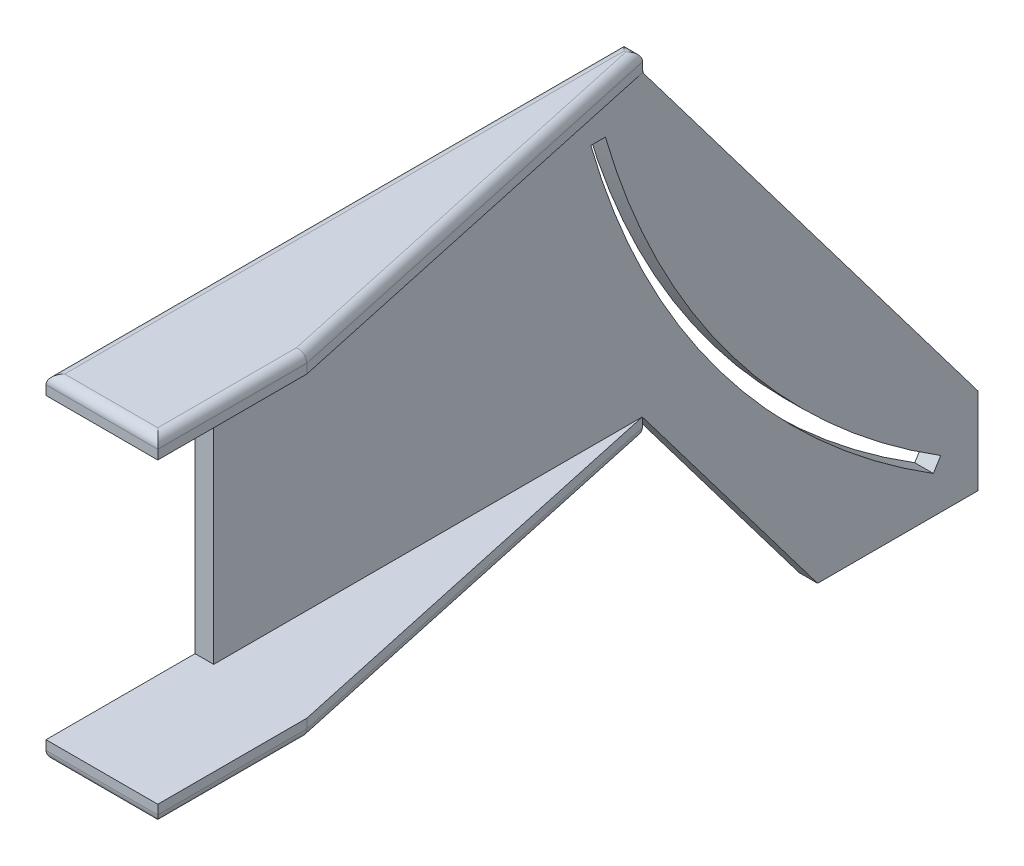
ISO-10303-21;
HEADER;
FILE_DESCRIPTION(('STEP AP214'),'2;1');
FILE_NAME('part.step','',(''),(''),'','','');
FILE_SCHEMA(('AUTOMOTIVE_DESIGN { 1 0 10303 214 1 1 1 1 }'));
ENDSEC;
DATA;
#1=APPLICATION_CONTEXT('core data for automotive mechanical design processes');
#2=APPLICATION_PROTOCOL_DEFINITION('international standard','automotive_design',2000,#1);
#3=PRODUCT_CONTEXT('',#1,'mechanical');
#4=PRODUCT('Part','Part','',(#3));
#5=PRODUCT_RELATED_PRODUCT_CATEGORY('part','',(#4));
#6=PRODUCT_DEFINITION_FORMATION('','',#4);
#7=PRODUCT_DEFINITION_CONTEXT('part definition',#1,'design');
#8=PRODUCT_DEFINITION('design','',#6,#7);
#9=PRODUCT_DEFINITION_SHAPE('','',#8);
#10=(LENGTH_UNIT() NAMED_UNIT(*) SI_UNIT(.MILLI.,.METRE.));
#11=(NAMED_UNIT(*) PLANE_ANGLE_UNIT() SI_UNIT($,.RADIAN.));
#12=(NAMED_UNIT(*) SI_UNIT($,.STERADIAN.) SOLID_ANGLE_UNIT());
#13=UNCERTAINTY_MEASURE_WITH_UNIT(LENGTH_MEASURE(1.E-05),#10,'distance_accuracy_value','');
#14=(GEOMETRIC_REPRESENTATION_CONTEXT(3) GLOBAL_UNCERTAINTY_ASSIGNED_CONTEXT((#13)) GLOBAL_UNIT_ASSIGNED_CONTEXT((#10,
#11,#12)) REPRESENTATION_CONTEXT('',''));
#15=CARTESIAN_POINT('',(0.,0.,0.));
#16=DIRECTION('',(0.,0.,1.));
#17=DIRECTION('',(1.,0.,0.));
#18=AXIS2_PLACEMENT_3D('',#15,#16,#17);
#19=CARTESIAN_POINT('',(3.175,0.,0.));
#20=DIRECTION('',(1.,0.,0.));
#21=DIRECTION('',(0.,0.,-1.));
#22=AXIS2_PLACEMENT_3D('',#19,#20,#21);
#23=PLANE('',#22);
#24=DIRECTION('',(0.,-1.,0.));
#25=VECTOR('',#24,1.);
#26=CARTESIAN_POINT('',(3.175,-30.226,193.675));
#27=LINE('',#26,#25);
#28=CARTESIAN_POINT('',(3.175,-30.226,193.675));
#29=VERTEX_POINT('',#28);
#30=CARTESIAN_POINT('',(3.175,-81.026,193.675));
#31=VERTEX_POINT('',#30);
#32=EDGE_CURVE('E236',#29,#31,#27,.T.);
#33=ORIENTED_EDGE('',*,*,#32,.T.);
#34=DIRECTION('',(0.,0.,-1.));
#35=VECTOR('',#34,1.);
#36=CARTESIAN_POINT('',(3.175,-81.026,193.675));
#37=LINE('',#36,#35);
#38=CARTESIAN_POINT('',(3.175,-81.026,120.620560185282));
#39=VERTEX_POINT('',#38);
#40=EDGE_CURVE('E223',#31,#39,#37,.T.);
#41=ORIENTED_EDGE('',*,*,#40,.T.);
#42=DIRECTION('',(0.,-0.797622102019196,-0.60315751041538));
#43=VECTOR('',#42,1.);
#44=CARTESIAN_POINT('',(3.175,-81.026,120.620560185282));
#45=LINE('',#44,#43);
#46=CARTESIAN_POINT('',(3.175,-120.52375363147,90.7525729679664));
#47=VERTEX_POINT('',#46);
#48=EDGE_CURVE('E232',#39,#47,#45,.T.);
#49=ORIENTED_EDGE('',*,*,#48,.T.);
#50=DIRECTION('',(0.,0.,-1.));
#51=VECTOR('',#50,1.);
#52=CARTESIAN_POINT('',(3.175,-120.52375363147,90.7525729679664));
#53=LINE('',#52,#51);
#54=CARTESIAN_POINT('',(3.175,-120.52375363147,63.4146273051298));
#55=VERTEX_POINT('',#54);
#56=EDGE_CURVE('E242',#47,#55,#53,.T.);
#57=ORIENTED_EDGE('',*,*,#56,.T.);
#58=DIRECTION('',(0.,1.,0.));
#59=VECTOR('',#58,1.);
#60=CARTESIAN_POINT('',(3.175,-105.80178632985,63.4146273051298));
#61=LINE('',#60,#59);
#62=CARTESIAN_POINT('',(3.175,-105.80178632985,63.4146273051298));
#63=VERTEX_POINT('',#62);
#64=EDGE_CURVE('E244',#55,#63,#61,.T.);
#65=ORIENTED_EDGE('',*,*,#64,.T.);
#66=DIRECTION('',(0.,0.797622102019196,0.60315751041538));
#67=VECTOR('',#66,1.);
#68=CARTESIAN_POINT('',(3.175,-30.226,120.56462730513));
#69=LINE('',#68,#67);
#70=CARTESIAN_POINT('',(3.175,-30.6508574659911,120.243352392085));
#71=VERTEX_POINT('',#70);
#72=EDGE_CURVE('E249',#63,#71,#69,.T.);
#73=ORIENTED_EDGE('',*,*,#72,.T.);
#74=CARTESIAN_POINT('',(3.175,-29.6933449182067,118.97712730513));
#75=DIRECTION('',(1.,0.,0.));
#76=DIRECTION('',(0.,0.,-1.));
#77=AXIS2_PLACEMENT_3D('',#74,#75,#76);
#78=CIRCLE('',#77,1.5875);
#79=CARTESIAN_POINT('',(3.175,-29.6933449182067,120.56462730513));
#80=VERTEX_POINT('',#79);
#81=EDGE_CURVE('E307',#71,#80,#78,.F.);
#82=ORIENTED_EDGE('',*,*,#81,.T.);
#83=DIRECTION('',(0.,1.,0.));
#84=VECTOR('',#83,1.);
#85=CARTESIAN_POINT('',(3.175,-27.051,120.56462730513));
#86=LINE('',#85,#84);
#87=CARTESIAN_POINT('',(3.175,-30.226,120.56462730513));
#88=VERTEX_POINT('',#87);
#89=EDGE_CURVE('E310',#88,#80,#86,.T.);
#90=ORIENTED_EDGE('',*,*,#89,.F.);
#91=DIRECTION('',(0.,0.,1.));
#92=VECTOR('',#91,1.);
#93=CARTESIAN_POINT('',(3.175,-30.226,193.675));
#94=LINE('',#93,#92);
#95=EDGE_CURVE('E252',#88,#29,#94,.T.);
#96=ORIENTED_EDGE('',*,*,#95,.T.);
#97=EDGE_LOOP('',(#33,#41,#49,#57,#65,#73,#82,#90,#96));
#98=FACE_BOUND('',#97,.T.);
#99=DIRECTION('',(0.,0.,1.));
#100=VECTOR('',#99,1.);
#101=CARTESIAN_POINT('',(3.175,-36.576,129.390973315616));
#102=LINE('',#101,#100);
#103=CARTESIAN_POINT('',(3.175,-36.576,126.91462730513));
#104=VERTEX_POINT('',#103);
#105=CARTESIAN_POINT('',(3.175,-36.576,129.390973315616));
#106=VERTEX_POINT('',#105);
#107=EDGE_CURVE('E401',#104,#106,#102,.T.);
#108=ORIENTED_EDGE('',*,*,#107,.F.);
#109=CARTESIAN_POINT('',(3.175,0.,0.));
#110=DIRECTION('',(-1.,0.,0.));
#111=DIRECTION('',(0.,0.,-1.));
#112=AXIS2_PLACEMENT_3D('',#109,#110,#111);
#113=CIRCLE('',#112,132.08);
#114=CARTESIAN_POINT('',(3.175,-112.15178632985,69.7646273051298));
#115=VERTEX_POINT('',#114);
#116=EDGE_CURVE('E399',#115,#104,#113,.T.);
#117=ORIENTED_EDGE('',*,*,#116,.F.);
#118=DIRECTION('',(0.,0.849120126664522,-0.528199782746288));
#119=VECTOR('',#118,1.);
#120=CARTESIAN_POINT('',(3.175,-114.17375363147,71.0224030377944));
#121=LINE('',#120,#119);
#122=CARTESIAN_POINT('',(3.175,-114.17375363147,71.0224030377944));
#123=VERTEX_POINT('',#122);
#124=EDGE_CURVE('E407',#123,#115,#121,.T.);
#125=ORIENTED_EDGE('',*,*,#124,.F.);
#126=CARTESIAN_POINT('',(3.175,0.,0.));
#127=DIRECTION('',(1.,0.,0.));
#128=DIRECTION('',(0.,0.,-1.));
#129=AXIS2_PLACEMENT_3D('',#126,#127,#128);
#130=CIRCLE('',#129,134.46125);
#131=EDGE_CURVE('E404',#106,#123,#130,.T.);
#132=ORIENTED_EDGE('',*,*,#131,.F.);
#133=EDGE_LOOP('',(#108,#117,#125,#132));
#134=FACE_BOUND('',#133,.T.);
#135=ADVANCED_FACE('F32',(#98,#134),#23,.T.);
#136=CARTESIAN_POINT('',(0.,0.,0.));
#137=DIRECTION('',(1.,0.,0.));
#138=DIRECTION('',(0.,0.,-1.));
#139=AXIS2_PLACEMENT_3D('',#136,#137,#138);
#140=PLANE('',#139);
#141=DIRECTION('',(0.,1.,0.));
#142=VECTOR('',#141,1.);
#143=CARTESIAN_POINT('',(0.,-84.201,120.620560185282));
#144=LINE('',#143,#142);
#145=CARTESIAN_POINT('',(0.,-82.6135,120.620560185282));
#146=VERTEX_POINT('',#145);
#147=CARTESIAN_POINT('',(0.,-81.026,120.620560185282));
#148=VERTEX_POINT('',#147);
#149=EDGE_CURVE('E208',#146,#148,#144,.T.);
#150=ORIENTED_EDGE('',*,*,#149,.F.);
#151=DIRECTION('',(0.,0.,-1.));
#152=VECTOR('',#151,1.);
#153=CARTESIAN_POINT('',(0.,-82.6135,219.075));
#154=LINE('',#153,#152);
#155=CARTESIAN_POINT('',(0.,-82.6135,219.075));
#156=VERTEX_POINT('',#155);
#157=EDGE_CURVE('E11',#146,#156,#154,.F.);
#158=ORIENTED_EDGE('',*,*,#157,.T.);
#159=DIRECTION('',(0.,1.,0.));
#160=VECTOR('',#159,1.);
#161=CARTESIAN_POINT('',(0.,-84.201,219.075));
#162=LINE('',#161,#160);
#163=CARTESIAN_POINT('',(0.,-81.026,219.075));
#164=VERTEX_POINT('',#163);
#165=EDGE_CURVE('E370',#156,#164,#162,.T.);
#166=ORIENTED_EDGE('',*,*,#165,.T.);
#167=DIRECTION('',(0.,0.,-1.));
#168=VECTOR('',#167,1.);
#169=CARTESIAN_POINT('',(0.,-81.026,219.075));
#170=LINE('',#169,#168);
#171=CARTESIAN_POINT('',(0.,-81.026,193.675));
#172=VERTEX_POINT('',#171);
#173=EDGE_CURVE('E228',#164,#172,#170,.T.);
#174=ORIENTED_EDGE('',*,*,#173,.T.);
#175=DIRECTION('',(0.,-1.,0.));
#176=VECTOR('',#175,1.);
#177=CARTESIAN_POINT('',(0.,-30.226,193.675));
#178=LINE('',#177,#176);
#179=CARTESIAN_POINT('',(0.,-30.226,193.675));
#180=VERTEX_POINT('',#179);
#181=EDGE_CURVE('E255',#180,#172,#178,.T.);
#182=ORIENTED_EDGE('',*,*,#181,.F.);
#183=DIRECTION('',(0.,0.,1.));
#184=VECTOR('',#183,1.);
#185=CARTESIAN_POINT('',(0.,-30.226,120.56462730513));
#186=LINE('',#185,#184);
#187=CARTESIAN_POINT('',(0.,-30.226,219.075));
#188=VERTEX_POINT('',#187);
#189=EDGE_CURVE('E327',#180,#188,#186,.T.);
#190=ORIENTED_EDGE('',*,*,#189,.T.);
#191=DIRECTION('',(0.,-1.,0.));
#192=VECTOR('',#191,1.);
#193=CARTESIAN_POINT('',(0.,-27.051,219.075));
#194=LINE('',#193,#192);
#195=CARTESIAN_POINT('',(0.,-28.6385,219.075));
#196=VERTEX_POINT('',#195);
#197=EDGE_CURVE('E396',#196,#188,#194,.T.);
#198=ORIENTED_EDGE('',*,*,#197,.F.);
#199=DIRECTION('',(0.,0.,1.));
#200=VECTOR('',#199,1.);
#201=CARTESIAN_POINT('',(0.,-28.6385,120.56462730513));
#202=LINE('',#201,#200);
#203=CARTESIAN_POINT('',(0.,-28.6385,120.56462730513));
#204=VERTEX_POINT('',#203);
#205=EDGE_CURVE('E303',#196,#204,#202,.F.);
#206=ORIENTED_EDGE('',*,*,#205,.T.);
#207=DIRECTION('',(0.,-1.,0.));
#208=VECTOR('',#207,1.);
#209=CARTESIAN_POINT('',(0.,-27.051,120.56462730513));
#210=LINE('',#209,#208);
#211=CARTESIAN_POINT('',(0.,-29.6933449182067,120.56462730513));
#212=VERTEX_POINT('',#211);
#213=EDGE_CURVE('E387',#204,#212,#210,.T.);
#214=ORIENTED_EDGE('',*,*,#213,.T.);
#215=CARTESIAN_POINT('',(0.,-29.6933449182067,118.97712730513));
#216=DIRECTION('',(1.,0.,0.));
#217=DIRECTION('',(0.,0.,-1.));
#218=AXIS2_PLACEMENT_3D('',#215,#216,#217);
#219=CIRCLE('',#218,1.5875);
#220=CARTESIAN_POINT('',(0.,-30.6508574659911,120.243352392085));
#221=VERTEX_POINT('',#220);
#222=EDGE_CURVE('E305',#212,#221,#219,.T.);
#223=ORIENTED_EDGE('',*,*,#222,.T.);
#224=DIRECTION('',(0.,0.797622102019196,0.60315751041538));
#225=VECTOR('',#224,1.);
#226=CARTESIAN_POINT('',(0.,-30.226,120.56462730513));
#227=LINE('',#226,#225);
#228=CARTESIAN_POINT('',(0.,-105.80178632985,63.4146273051298));
#229=VERTEX_POINT('',#228);
#230=EDGE_CURVE('E265',#229,#221,#227,.T.);
#231=ORIENTED_EDGE('',*,*,#230,.F.);
#232=DIRECTION('',(0.,1.,0.));
#233=VECTOR('',#232,1.);
#234=CARTESIAN_POINT('',(0.,-105.80178632985,63.4146273051298));
#235=LINE('',#234,#233);
#236=CARTESIAN_POINT('',(0.,-120.52375363147,63.4146273051298));
#237=VERTEX_POINT('',#236);
#238=EDGE_CURVE('E263',#237,#229,#235,.T.);
#239=ORIENTED_EDGE('',*,*,#238,.F.);
#240=DIRECTION('',(0.,0.,-1.));
#241=VECTOR('',#240,1.);
#242=CARTESIAN_POINT('',(0.,-120.52375363147,90.7525729679664));
#243=LINE('',#242,#241);
#244=CARTESIAN_POINT('',(0.,-120.52375363147,90.7525729679664));
#245=VERTEX_POINT('',#244);
#246=EDGE_CURVE('E261',#245,#237,#243,.T.);
#247=ORIENTED_EDGE('',*,*,#246,.F.);
#248=DIRECTION('',(0.,-0.797622102019196,-0.60315751041538));
#249=VECTOR('',#248,1.);
#250=CARTESIAN_POINT('',(0.,-81.026,120.620560185282));
#251=LINE('',#250,#249);
#252=EDGE_CURVE('E258',#148,#245,#251,.T.);
#253=ORIENTED_EDGE('',*,*,#252,.F.);
#254=EDGE_LOOP('',(#150,#158,#166,#174,#182,#190,#198,#206,#214,#223,#231,#239,#247,#253));
#255=FACE_BOUND('',#254,.T.);
#256=CARTESIAN_POINT('',(0.,0.,0.));
#257=DIRECTION('',(-1.,0.,0.));
#258=DIRECTION('',(0.,0.,-1.));
#259=AXIS2_PLACEMENT_3D('',#256,#257,#258);
#260=CIRCLE('',#259,132.08);
#261=CARTESIAN_POINT('',(0.,-112.15178632985,69.7646273051298));
#262=VERTEX_POINT('',#261);
#263=CARTESIAN_POINT('',(0.,-36.576,126.91462730513));
#264=VERTEX_POINT('',#263);
#265=EDGE_CURVE('E398',#262,#264,#260,.T.);
#266=ORIENTED_EDGE('',*,*,#265,.T.);
#267=DIRECTION('',(0.,0.,1.));
#268=VECTOR('',#267,1.);
#269=CARTESIAN_POINT('',(0.,-36.576,129.390973315616));
#270=LINE('',#269,#268);
#271=CARTESIAN_POINT('',(0.,-36.576,129.390973315616));
#272=VERTEX_POINT('',#271);
#273=EDGE_CURVE('E412',#264,#272,#270,.T.);
#274=ORIENTED_EDGE('',*,*,#273,.T.);
#275=CARTESIAN_POINT('',(0.,0.,0.));
#276=DIRECTION('',(1.,0.,0.));
#277=DIRECTION('',(0.,0.,-1.));
#278=AXIS2_PLACEMENT_3D('',#275,#276,#277);
#279=CIRCLE('',#278,134.46125);
#280=CARTESIAN_POINT('',(0.,-114.17375363147,71.0224030377944));
#281=VERTEX_POINT('',#280);
#282=EDGE_CURVE('E415',#272,#281,#279,.T.);
#283=ORIENTED_EDGE('',*,*,#282,.T.);
#284=DIRECTION('',(0.,0.849120126664522,-0.528199782746288));
#285=VECTOR('',#284,1.);
#286=CARTESIAN_POINT('',(0.,-114.17375363147,71.0224030377944));
#287=LINE('',#286,#285);
#288=EDGE_CURVE('E402',#281,#262,#287,.T.);
#289=ORIENTED_EDGE('',*,*,#288,.T.);
#290=EDGE_LOOP('',(#266,#274,#283,#289));
#291=FACE_BOUND('',#290,.T.);
#292=ADVANCED_FACE('F435',(#255,#291),#140,.F.);
#293=CARTESIAN_POINT('',(3.175,-30.226,193.675));
#294=DIRECTION('',(0.,0.,-1.));
#295=DIRECTION('',(-1.,0.,0.));
#296=AXIS2_PLACEMENT_3D('',#293,#294,#295);
#297=PLANE('',#296);
#298=ORIENTED_EDGE('',*,*,#181,.T.);
#299=DIRECTION('',(-1.,0.,0.));
#300=VECTOR('',#299,1.);
#301=CARTESIAN_POINT('',(3.175,-81.026,193.675));
#302=LINE('',#301,#300);
#303=EDGE_CURVE('E217',#31,#172,#302,.T.);
#304=ORIENTED_EDGE('',*,*,#303,.F.);
#305=ORIENTED_EDGE('',*,*,#32,.F.);
#306=DIRECTION('',(-1.,0.,0.));
#307=VECTOR('',#306,1.);
#308=CARTESIAN_POINT('',(3.175,-30.226,193.675));
#309=LINE('',#308,#307);
#310=EDGE_CURVE('E254',#29,#180,#309,.T.);
#311=ORIENTED_EDGE('',*,*,#310,.T.);
#312=EDGE_LOOP('',(#298,#304,#305,#311));
#313=FACE_BOUND('',#312,.T.);
#314=ADVANCED_FACE('F460',(#313),#297,.F.);
#315=CARTESIAN_POINT('',(3.175,-81.026,120.620560185282));
#316=DIRECTION('',(0.,0.60315751041538,-0.797622102019196));
#317=DIRECTION('',(0.,0.797622102019196,0.60315751041538));
#318=AXIS2_PLACEMENT_3D('',#315,#316,#317);
#319=PLANE('',#318);
#320=ORIENTED_EDGE('',*,*,#252,.T.);
#321=DIRECTION('',(-1.,0.,0.));
#322=VECTOR('',#321,1.);
#323=CARTESIAN_POINT('',(3.175,-120.52375363147,90.7525729679664));
#324=LINE('',#323,#322);
#325=EDGE_CURVE('E218',#47,#245,#324,.T.);
#326=ORIENTED_EDGE('',*,*,#325,.F.);
#327=ORIENTED_EDGE('',*,*,#48,.F.);
#328=DIRECTION('',(-1.,0.,0.));
#329=VECTOR('',#328,1.);
#330=CARTESIAN_POINT('',(3.175,-81.026,120.620560185282));
#331=LINE('',#330,#329);
#332=EDGE_CURVE('E212',#39,#148,#331,.T.);
#333=ORIENTED_EDGE('',*,*,#332,.T.);
#334=EDGE_LOOP('',(#320,#326,#327,#333));
#335=FACE_BOUND('',#334,.T.);
#336=ADVANCED_FACE('F239',(#335),#319,.F.);
#337=CARTESIAN_POINT('',(3.175,-120.52375363147,90.7525729679664));
#338=DIRECTION('',(0.,1.,0.));
#339=DIRECTION('',(0.,0.,1.));
#340=AXIS2_PLACEMENT_3D('',#337,#338,#339);
#341=PLANE('',#340);
#342=ORIENTED_EDGE('',*,*,#246,.T.);
#343=DIRECTION('',(-1.,0.,0.));
#344=VECTOR('',#343,1.);
#345=CARTESIAN_POINT('',(3.175,-120.52375363147,63.4146273051298));
#346=LINE('',#345,#344);
#347=EDGE_CURVE('E273',#55,#237,#346,.T.);
#348=ORIENTED_EDGE('',*,*,#347,.F.);
#349=ORIENTED_EDGE('',*,*,#56,.F.);
#350=ORIENTED_EDGE('',*,*,#325,.T.);
#351=EDGE_LOOP('',(#342,#348,#349,#350));
#352=FACE_BOUND('',#351,.T.);
#353=ADVANCED_FACE('F471',(#352),#341,.F.);
#354=CARTESIAN_POINT('',(3.175,-105.80178632985,63.4146273051298));
#355=DIRECTION('',(0.,0.,1.));
#356=DIRECTION('',(1.,0.,0.));
#357=AXIS2_PLACEMENT_3D('',#354,#355,#356);
#358=PLANE('',#357);
#359=ORIENTED_EDGE('',*,*,#238,.T.);
#360=DIRECTION('',(-1.,0.,0.));
#361=VECTOR('',#360,1.);
#362=CARTESIAN_POINT('',(3.175,-105.80178632985,63.4146273051298));
#363=LINE('',#362,#361);
#364=EDGE_CURVE('E270',#63,#229,#363,.T.);
#365=ORIENTED_EDGE('',*,*,#364,.F.);
#366=ORIENTED_EDGE('',*,*,#64,.F.);
#367=ORIENTED_EDGE('',*,*,#347,.T.);
#368=EDGE_LOOP('',(#359,#365,#366,#367));
#369=FACE_BOUND('',#368,.T.);
#370=ADVANCED_FACE('F467',(#369),#358,.F.);
#371=CARTESIAN_POINT('',(3.175,-30.226,120.56462730513));
#372=DIRECTION('',(0.,-0.60315751041538,0.797622102019196));
#373=DIRECTION('',(0.,-0.797622102019196,-0.60315751041538));
#374=AXIS2_PLACEMENT_3D('',#371,#372,#373);
#375=PLANE('',#374);
#376=ORIENTED_EDGE('',*,*,#230,.T.);
#377=DIRECTION('',(-1.,0.,0.));
#378=VECTOR('',#377,1.);
#379=CARTESIAN_POINT('',(3.175,-30.6508574659911,120.243352392085));
#380=LINE('',#379,#378);
#381=EDGE_CURVE('E283',#221,#71,#380,.F.);
#382=ORIENTED_EDGE('',*,*,#381,.T.);
#383=ORIENTED_EDGE('',*,*,#72,.F.);
#384=ORIENTED_EDGE('',*,*,#364,.T.);
#385=EDGE_LOOP('',(#376,#382,#383,#384));
#386=FACE_BOUND('',#385,.T.);
#387=ADVANCED_FACE('F464',(#386),#375,.F.);
#388=CARTESIAN_POINT('',(3.175,0.,0.));
#389=DIRECTION('',(-1.,0.,0.));
#390=DIRECTION('',(0.,0.,1.));
#391=AXIS2_PLACEMENT_3D('',#388,#389,#390);
#392=CYLINDRICAL_SURFACE('',#391,132.08);
#393=ORIENTED_EDGE('',*,*,#265,.F.);
#394=DIRECTION('',(-1.,0.,0.));
#395=VECTOR('',#394,1.);
#396=CARTESIAN_POINT('',(3.175,-112.15178632985,69.7646273051298));
#397=LINE('',#396,#395);
#398=EDGE_CURVE('E409',#115,#262,#397,.T.);
#399=ORIENTED_EDGE('',*,*,#398,.F.);
#400=ORIENTED_EDGE('',*,*,#116,.T.);
#401=DIRECTION('',(-1.,0.,0.));
#402=VECTOR('',#401,1.);
#403=CARTESIAN_POINT('',(3.175,-36.576,126.91462730513));
#404=LINE('',#403,#402);
#405=EDGE_CURVE('E259',#104,#264,#404,.T.);
#406=ORIENTED_EDGE('',*,*,#405,.T.);
#407=EDGE_LOOP('',(#393,#399,#400,#406));
#408=FACE_BOUND('',#407,.T.);
#409=ADVANCED_FACE('F429',(#408),#392,.T.);
#410=CARTESIAN_POINT('',(3.175,-36.576,129.390973315616));
#411=DIRECTION('',(0.,-1.,0.));
#412=DIRECTION('',(0.,0.,-1.));
#413=AXIS2_PLACEMENT_3D('',#410,#411,#412);
#414=PLANE('',#413);
#415=ORIENTED_EDGE('',*,*,#273,.F.);
#416=ORIENTED_EDGE('',*,*,#405,.F.);
#417=ORIENTED_EDGE('',*,*,#107,.T.);
#418=DIRECTION('',(-1.,0.,0.));
#419=VECTOR('',#418,1.);
#420=CARTESIAN_POINT('',(3.175,-36.576,129.390973315616));
#421=LINE('',#420,#419);
#422=EDGE_CURVE('E424',#106,#272,#421,.T.);
#423=ORIENTED_EDGE('',*,*,#422,.T.);
#424=EDGE_LOOP('',(#415,#416,#417,#423));
#425=FACE_BOUND('',#424,.T.);
#426=ADVANCED_FACE('F443',(#425),#414,.T.);
#427=CARTESIAN_POINT('',(3.175,0.,0.));
#428=DIRECTION('',(-1.,0.,0.));
#429=DIRECTION('',(0.,0.,1.));
#430=AXIS2_PLACEMENT_3D('',#427,#428,#429);
#431=CYLINDRICAL_SURFACE('',#430,134.46125);
#432=ORIENTED_EDGE('',*,*,#282,.F.);
#433=ORIENTED_EDGE('',*,*,#422,.F.);
#434=ORIENTED_EDGE('',*,*,#131,.T.);
#435=DIRECTION('',(-1.,0.,0.));
#436=VECTOR('',#435,1.);
#437=CARTESIAN_POINT('',(3.175,-114.17375363147,71.0224030377944));
#438=LINE('',#437,#436);
#439=EDGE_CURVE('E422',#123,#281,#438,.T.);
#440=ORIENTED_EDGE('',*,*,#439,.T.);
#441=EDGE_LOOP('',(#432,#433,#434,#440));
#442=FACE_BOUND('',#441,.T.);
#443=ADVANCED_FACE('F445',(#442),#431,.F.);
#444=CARTESIAN_POINT('',(3.175,-114.17375363147,71.0224030377944));
#445=DIRECTION('',(0.,0.528199782746288,0.849120126664522));
#446=DIRECTION('',(0.,-0.849120126664523,0.528199782746288));
#447=AXIS2_PLACEMENT_3D('',#444,#445,#446);
#448=PLANE('',#447);
#449=ORIENTED_EDGE('',*,*,#288,.F.);
#450=ORIENTED_EDGE('',*,*,#439,.F.);
#451=ORIENTED_EDGE('',*,*,#124,.T.);
#452=ORIENTED_EDGE('',*,*,#398,.T.);
#453=EDGE_LOOP('',(#449,#450,#451,#452));
#454=FACE_BOUND('',#453,.T.);
#455=ADVANCED_FACE('F439',(#454),#448,.T.);
#456=CARTESIAN_POINT('',(0.,-27.051,219.075));
#457=DIRECTION('',(0.,0.,-1.));
#458=DIRECTION('',(-1.,0.,0.));
#459=AXIS2_PLACEMENT_3D('',#456,#457,#458);
#460=PLANE('',#459);
#461=DIRECTION('',(0.,-1.,0.));
#462=VECTOR('',#461,1.);
#463=CARTESIAN_POINT('',(19.05,-27.051,219.075));
#464=LINE('',#463,#462);
#465=CARTESIAN_POINT('',(19.05,-28.6385,219.075));
#466=VERTEX_POINT('',#465);
#467=CARTESIAN_POINT('',(19.05,-30.226,219.075));
#468=VERTEX_POINT('',#467);
#469=EDGE_CURVE('E394',#466,#468,#464,.T.);
#470=ORIENTED_EDGE('',*,*,#469,.F.);
#471=DIRECTION('',(1.,0.,0.));
#472=VECTOR('',#471,1.);
#473=CARTESIAN_POINT('',(0.,-28.6385,219.075));
#474=LINE('',#473,#472);
#475=EDGE_CURVE('E296',#466,#196,#474,.F.);
#476=ORIENTED_EDGE('',*,*,#475,.T.);
#477=ORIENTED_EDGE('',*,*,#197,.T.);
#478=DIRECTION('',(1.,0.,0.));
#479=VECTOR('',#478,1.);
#480=CARTESIAN_POINT('',(0.,-30.226,219.075));
#481=LINE('',#480,#479);
#482=EDGE_CURVE('E378',#188,#468,#481,.T.);
#483=ORIENTED_EDGE('',*,*,#482,.T.);
#484=EDGE_LOOP('',(#470,#476,#477,#483));
#485=FACE_BOUND('',#484,.T.);
#486=ADVANCED_FACE('F452',(#485),#460,.F.);
#487=CARTESIAN_POINT('',(19.05,-27.051,193.675));
#488=DIRECTION('',(-1.,0.,0.));
#489=DIRECTION('',(0.,0.,1.));
#490=AXIS2_PLACEMENT_3D('',#487,#488,#489);
#491=PLANE('',#490);
#492=DIRECTION('',(0.,-1.,0.));
#493=VECTOR('',#492,1.);
#494=CARTESIAN_POINT('',(19.05,-27.051,193.675));
#495=LINE('',#494,#493);
#496=CARTESIAN_POINT('',(19.05,-28.6385,193.675));
#497=VERTEX_POINT('',#496);
#498=CARTESIAN_POINT('',(19.05,-30.226,193.675));
#499=VERTEX_POINT('',#498);
#500=EDGE_CURVE('E392',#497,#499,#495,.T.);
#501=ORIENTED_EDGE('',*,*,#500,.F.);
#502=DIRECTION('',(0.,0.,-1.));
#503=VECTOR('',#502,1.);
#504=CARTESIAN_POINT('',(19.05,-28.6385,219.075));
#505=LINE('',#504,#503);
#506=EDGE_CURVE('E299',#497,#466,#505,.F.);
#507=ORIENTED_EDGE('',*,*,#506,.T.);
#508=ORIENTED_EDGE('',*,*,#469,.T.);
#509=DIRECTION('',(0.,0.,-1.));
#510=VECTOR('',#509,1.);
#511=CARTESIAN_POINT('',(19.05,-30.226,193.675));
#512=LINE('',#511,#510);
#513=EDGE_CURVE('E381',#468,#499,#512,.T.);
#514=ORIENTED_EDGE('',*,*,#513,.T.);
#515=EDGE_LOOP('',(#501,#507,#508,#514));
#516=FACE_BOUND('',#515,.T.);
#517=ADVANCED_FACE('F575',(#516),#491,.F.);
#518=CARTESIAN_POINT('',(3.175,-27.051,120.56462730513));
#519=DIRECTION('',(-0.977227830330708,0.,0.212192760543656));
#520=DIRECTION('',(0.212192760543656,0.,0.977227830330708));
#521=AXIS2_PLACEMENT_3D('',#518,#519,#520);
#522=PLANE('',#521);
#523=DIRECTION('',(0.,-1.,0.));
#524=VECTOR('',#523,1.);
#525=CARTESIAN_POINT('',(3.175,-27.051,120.56462730513));
#526=LINE('',#525,#524);
#527=CARTESIAN_POINT('',(3.175,-28.6385,120.56462730513));
#528=VERTEX_POINT('',#527);
#529=EDGE_CURVE('E390',#528,#80,#526,.T.);
#530=ORIENTED_EDGE('',*,*,#529,.F.);
#531=DIRECTION('',(-0.212192760543656,0.,-0.977227830330708));
#532=VECTOR('',#531,1.);
#533=CARTESIAN_POINT('',(19.05,-28.6385,193.675));
#534=LINE('',#533,#532);
#535=EDGE_CURVE('E301',#528,#497,#534,.F.);
#536=ORIENTED_EDGE('',*,*,#535,.T.);
#537=ORIENTED_EDGE('',*,*,#500,.T.);
#538=DIRECTION('',(-0.212192760543656,0.,-0.977227830330708));
#539=VECTOR('',#538,1.);
#540=CARTESIAN_POINT('',(3.175,-30.226,120.56462730513));
#541=LINE('',#540,#539);
#542=EDGE_CURVE('E384',#499,#88,#541,.T.);
#543=ORIENTED_EDGE('',*,*,#542,.T.);
#544=ORIENTED_EDGE('',*,*,#89,.T.);
#545=EDGE_LOOP('',(#530,#536,#537,#543,#544));
#546=FACE_BOUND('',#545,.T.);
#547=ADVANCED_FACE('F573',(#546),#522,.F.);
#548=CARTESIAN_POINT('',(0.,-27.051,120.56462730513));
#549=DIRECTION('',(0.,0.,1.));
#550=DIRECTION('',(1.,0.,0.));
#551=AXIS2_PLACEMENT_3D('',#548,#549,#550);
#552=PLANE('',#551);
#553=ORIENTED_EDGE('',*,*,#529,.T.);
#554=DIRECTION('',(-1.,0.,0.));
#555=VECTOR('',#554,1.);
#556=CARTESIAN_POINT('',(0.,-29.6933449182067,120.56462730513));
#557=LINE('',#556,#555);
#558=EDGE_CURVE('E280',#80,#212,#557,.T.);
#559=ORIENTED_EDGE('',*,*,#558,.T.);
#560=ORIENTED_EDGE('',*,*,#213,.F.);
#561=DIRECTION('',(-1.,0.,0.));
#562=VECTOR('',#561,1.);
#563=CARTESIAN_POINT('',(3.175,-28.6385,120.56462730513));
#564=LINE('',#563,#562);
#565=EDGE_CURVE('E278',#204,#528,#564,.F.);
#566=ORIENTED_EDGE('',*,*,#565,.T.);
#567=EDGE_LOOP('',(#553,#559,#560,#566));
#568=FACE_BOUND('',#567,.T.);
#569=ADVANCED_FACE('F566',(#568),#552,.F.);
#570=CARTESIAN_POINT('',(0.,-27.051,0.));
#571=DIRECTION('',(0.,1.,0.));
#572=DIRECTION('',(0.,0.,1.));
#573=AXIS2_PLACEMENT_3D('',#570,#571,#572);
#574=PLANE('',#573);
#575=DIRECTION('',(0.,0.,1.));
#576=VECTOR('',#575,1.);
#577=CARTESIAN_POINT('',(1.5875,-27.051,219.075));
#578=LINE('',#577,#576);
#579=CARTESIAN_POINT('',(1.5875,-27.051,122.15212730513));
#580=VERTEX_POINT('',#579);
#581=CARTESIAN_POINT('',(1.5875,-27.051,217.4875));
#582=VERTEX_POINT('',#581);
#583=EDGE_CURVE('E285',#580,#582,#578,.T.);
#584=ORIENTED_EDGE('',*,*,#583,.T.);
#585=DIRECTION('',(1.,0.,0.));
#586=VECTOR('',#585,1.);
#587=CARTESIAN_POINT('',(19.05,-27.051,217.4875));
#588=LINE('',#587,#586);
#589=CARTESIAN_POINT('',(17.4625,-27.051,217.4875));
#590=VERTEX_POINT('',#589);
#591=EDGE_CURVE('E293',#582,#590,#588,.T.);
#592=ORIENTED_EDGE('',*,*,#591,.T.);
#593=DIRECTION('',(0.,0.,-1.));
#594=VECTOR('',#593,1.);
#595=CARTESIAN_POINT('',(17.4625,-27.051,193.675));
#596=LINE('',#595,#594);
#597=CARTESIAN_POINT('',(17.4625,-27.051,193.845367826204));
#598=VERTEX_POINT('',#597);
#599=EDGE_CURVE('E291',#590,#598,#596,.T.);
#600=ORIENTED_EDGE('',*,*,#599,.T.);
#601=DIRECTION('',(-0.212192760543656,0.,-0.977227830330708));
#602=VECTOR('',#601,1.);
#603=CARTESIAN_POINT('',(1.62365081935001,-27.051,120.901483312493));
#604=LINE('',#603,#602);
#605=CARTESIAN_POINT('',(1.89521246855637,-27.051,122.15212730513));
#606=VERTEX_POINT('',#605);
#607=EDGE_CURVE('E289',#598,#606,#604,.T.);
#608=ORIENTED_EDGE('',*,*,#607,.T.);
#609=DIRECTION('',(-1.,0.,0.));
#610=VECTOR('',#609,1.);
#611=CARTESIAN_POINT('',(0.,-27.051,122.15212730513));
#612=LINE('',#611,#610);
#613=EDGE_CURVE('E287',#606,#580,#612,.T.);
#614=ORIENTED_EDGE('',*,*,#613,.T.);
#615=EDGE_LOOP('',(#584,#592,#600,#608,#614));
#616=FACE_BOUND('',#615,.T.);
#617=ADVANCED_FACE('F559',(#616),#574,.T.);
#618=CARTESIAN_POINT('',(0.,-30.226,0.));
#619=DIRECTION('',(0.,1.,0.));
#620=DIRECTION('',(0.,0.,1.));
#621=AXIS2_PLACEMENT_3D('',#618,#619,#620);
#622=PLANE('',#621);
#623=ORIENTED_EDGE('',*,*,#310,.F.);
#624=ORIENTED_EDGE('',*,*,#95,.F.);
#625=ORIENTED_EDGE('',*,*,#542,.F.);
#626=ORIENTED_EDGE('',*,*,#513,.F.);
#627=ORIENTED_EDGE('',*,*,#482,.F.);
#628=ORIENTED_EDGE('',*,*,#189,.F.);
#629=EDGE_LOOP('',(#623,#624,#625,#626,#627,#628));
#630=FACE_BOUND('',#629,.T.);
#631=ADVANCED_FACE('F485',(#630),#622,.F.);
#632=CARTESIAN_POINT('',(0.,-29.6933449182067,118.97712730513));
#633=DIRECTION('',(1.,0.,0.));
#634=DIRECTION('',(0.,0.,-1.));
#635=AXIS2_PLACEMENT_3D('',#632,#633,#634);
#636=CYLINDRICAL_SURFACE('',#635,1.5875);
#637=ORIENTED_EDGE('',*,*,#81,.F.);
#638=ORIENTED_EDGE('',*,*,#381,.F.);
#639=ORIENTED_EDGE('',*,*,#222,.F.);
#640=ORIENTED_EDGE('',*,*,#558,.F.);
#641=EDGE_LOOP('',(#637,#638,#639,#640));
#642=FACE_BOUND('',#641,.T.);
#643=ADVANCED_FACE('F481',(#642),#636,.F.);
#644=CARTESIAN_POINT('',(0.,-28.6385,122.15212730513));
#645=DIRECTION('',(1.,0.,0.));
#646=DIRECTION('',(0.,0.,-1.));
#647=AXIS2_PLACEMENT_3D('',#644,#645,#646);
#648=CYLINDRICAL_SURFACE('',#647,1.5875);
#649=CARTESIAN_POINT('',(1.5875,-28.6385,122.15212730513));
#650=DIRECTION('',(0.707106781186547,0.,-0.707106781186547));
#651=DIRECTION('',(-0.707106781186547,0.,-0.707106781186547));
#652=AXIS2_PLACEMENT_3D('',#649,#650,#651);
#653=ELLIPSE('',#652,2.24506403026729,1.5875);
#654=EDGE_CURVE('E321',#580,#204,#653,.F.);
#655=ORIENTED_EDGE('',*,*,#654,.F.);
#656=ORIENTED_EDGE('',*,*,#613,.F.);
#657=CARTESIAN_POINT('',(1.89521246855638,-28.6385,122.15212730513));
#658=DIRECTION('',(0.778521920225646,0.,0.627617415093122));
#659=DIRECTION('',(0.627617415093122,0.,-0.778521920225646));
#660=AXIS2_PLACEMENT_3D('',#657,#658,#659);
#661=ELLIPSE('',#660,2.03912049071127,1.5875);
#662=EDGE_CURVE('E324',#528,#606,#661,.T.);
#663=ORIENTED_EDGE('',*,*,#662,.F.);
#664=ORIENTED_EDGE('',*,*,#565,.F.);
#665=EDGE_LOOP('',(#655,#656,#663,#664));
#666=FACE_BOUND('',#665,.T.);
#667=ADVANCED_FACE('F484',(#666),#648,.T.);
#668=CARTESIAN_POINT('',(-23.5196680094768,-28.6385,5.1070007700377));
#669=DIRECTION('',(0.212192760543656,0.,0.977227830330708));
#670=DIRECTION('',(0.977227830330708,0.,-0.212192760543656));
#671=AXIS2_PLACEMENT_3D('',#668,#669,#670);
#672=CYLINDRICAL_SURFACE('',#671,1.5875);
#673=ORIENTED_EDGE('',*,*,#662,.T.);
#674=ORIENTED_EDGE('',*,*,#607,.F.);
#675=CARTESIAN_POINT('',(17.4625,-28.6385,193.845367826204));
#676=DIRECTION('',(0.106705598890808,0.,0.994290659297046));
#677=DIRECTION('',(0.994290659297046,0.,-0.106705598890808));
#678=AXIS2_PLACEMENT_3D('',#675,#676,#677);
#679=ELLIPSE('',#678,1.59661562256086,1.5875);
#680=EDGE_CURVE('E318',#497,#598,#679,.T.);
#681=ORIENTED_EDGE('',*,*,#680,.F.);
#682=ORIENTED_EDGE('',*,*,#535,.F.);
#683=EDGE_LOOP('',(#673,#674,#681,#682));
#684=FACE_BOUND('',#683,.T.);
#685=ADVANCED_FACE('F498',(#684),#672,.T.);
#686=CARTESIAN_POINT('',(1.5875,-28.6385,0.));
#687=DIRECTION('',(0.,0.,-1.));
#688=DIRECTION('',(-1.,0.,0.));
#689=AXIS2_PLACEMENT_3D('',#686,#687,#688);
#690=CYLINDRICAL_SURFACE('',#689,1.5875);
#691=ORIENTED_EDGE('',*,*,#654,.T.);
#692=ORIENTED_EDGE('',*,*,#205,.F.);
#693=CARTESIAN_POINT('',(1.5875,-28.6385,217.4875));
#694=DIRECTION('',(-0.707106781186547,0.,-0.707106781186547));
#695=DIRECTION('',(0.707106781186547,0.,-0.707106781186547));
#696=AXIS2_PLACEMENT_3D('',#693,#694,#695);
#697=ELLIPSE('',#696,2.24506403026729,1.5875);
#698=EDGE_CURVE('E316',#582,#196,#697,.F.);
#699=ORIENTED_EDGE('',*,*,#698,.F.);
#700=ORIENTED_EDGE('',*,*,#583,.F.);
#701=EDGE_LOOP('',(#691,#692,#699,#700));
#702=FACE_BOUND('',#701,.T.);
#703=ADVANCED_FACE('F494',(#702),#690,.T.);
#704=CARTESIAN_POINT('',(17.4625,-28.6385,0.));
#705=DIRECTION('',(0.,0.,1.));
#706=DIRECTION('',(1.,0.,0.));
#707=AXIS2_PLACEMENT_3D('',#704,#705,#706);
#708=CYLINDRICAL_SURFACE('',#707,1.5875);
#709=ORIENTED_EDGE('',*,*,#680,.T.);
#710=ORIENTED_EDGE('',*,*,#599,.F.);
#711=CARTESIAN_POINT('',(17.4625,-28.6385,217.4875));
#712=DIRECTION('',(-0.707106781186547,0.,0.707106781186547));
#713=DIRECTION('',(0.707106781186547,0.,0.707106781186547));
#714=AXIS2_PLACEMENT_3D('',#711,#712,#713);
#715=ELLIPSE('',#714,2.24506403026729,1.5875);
#716=EDGE_CURVE('E314',#466,#590,#715,.T.);
#717=ORIENTED_EDGE('',*,*,#716,.F.);
#718=ORIENTED_EDGE('',*,*,#506,.F.);
#719=EDGE_LOOP('',(#709,#710,#717,#718));
#720=FACE_BOUND('',#719,.T.);
#721=ADVANCED_FACE('F490',(#720),#708,.T.);
#722=CARTESIAN_POINT('',(0.,-28.6385,217.4875));
#723=DIRECTION('',(-1.,0.,0.));
#724=DIRECTION('',(0.,0.,1.));
#725=AXIS2_PLACEMENT_3D('',#722,#723,#724);
#726=CYLINDRICAL_SURFACE('',#725,1.5875);
#727=ORIENTED_EDGE('',*,*,#698,.T.);
#728=ORIENTED_EDGE('',*,*,#475,.F.);
#729=ORIENTED_EDGE('',*,*,#716,.T.);
#730=ORIENTED_EDGE('',*,*,#591,.F.);
#731=EDGE_LOOP('',(#727,#728,#729,#730));
#732=FACE_BOUND('',#731,.T.);
#733=ADVANCED_FACE('F487',(#732),#726,.T.);
#734=CARTESIAN_POINT('',(0.,-84.201,120.620560185282));
#735=DIRECTION('',(0.,0.,1.));
#736=DIRECTION('',(1.,0.,0.));
#737=AXIS2_PLACEMENT_3D('',#734,#735,#736);
#738=PLANE('',#737);
#739=DIRECTION('',(0.,1.,0.));
#740=VECTOR('',#739,1.);
#741=CARTESIAN_POINT('',(3.175,-84.201,120.620560185282));
#742=LINE('',#741,#740);
#743=CARTESIAN_POINT('',(3.175,-82.6135,120.620560185282));
#744=VERTEX_POINT('',#743);
#745=EDGE_CURVE('E201',#744,#39,#742,.T.);
#746=ORIENTED_EDGE('',*,*,#745,.F.);
#747=DIRECTION('',(1.,0.,0.));
#748=VECTOR('',#747,1.);
#749=CARTESIAN_POINT('',(0.,-82.6135,120.620560185282));
#750=LINE('',#749,#748);
#751=EDGE_CURVE('E41',#744,#146,#750,.F.);
#752=ORIENTED_EDGE('',*,*,#751,.T.);
#753=ORIENTED_EDGE('',*,*,#149,.T.);
#754=ORIENTED_EDGE('',*,*,#332,.F.);
#755=EDGE_LOOP('',(#746,#752,#753,#754));
#756=FACE_BOUND('',#755,.T.);
#757=ADVANCED_FACE('F213',(#756),#738,.F.);
#758=CARTESIAN_POINT('',(3.175,-84.201,120.620560185282));
#759=DIRECTION('',(-0.977194130999768,0.,0.212347899305853));
#760=DIRECTION('',(0.212347899305853,0.,0.977194130999768));
#761=AXIS2_PLACEMENT_3D('',#758,#759,#760);
#762=PLANE('',#761);
#763=DIRECTION('',(0.,1.,0.));
#764=VECTOR('',#763,1.);
#765=CARTESIAN_POINT('',(19.05,-84.201,193.675));
#766=LINE('',#765,#764);
#767=CARTESIAN_POINT('',(19.05,-82.6135,193.675));
#768=VERTEX_POINT('',#767);
#769=CARTESIAN_POINT('',(19.05,-81.026,193.675));
#770=VERTEX_POINT('',#769);
#771=EDGE_CURVE('E209',#768,#770,#766,.T.);
#772=ORIENTED_EDGE('',*,*,#771,.F.);
#773=DIRECTION('',(0.212347899305853,0.,0.977194130999768));
#774=VECTOR('',#773,1.);
#775=CARTESIAN_POINT('',(3.17500000000001,-82.6135,120.620560185282));
#776=LINE('',#775,#774);
#777=EDGE_CURVE('E56',#768,#744,#776,.F.);
#778=ORIENTED_EDGE('',*,*,#777,.T.);
#779=ORIENTED_EDGE('',*,*,#745,.T.);
#780=DIRECTION('',(0.212347899305853,0.,0.977194130999768));
#781=VECTOR('',#780,1.);
#782=CARTESIAN_POINT('',(3.175,-81.026,120.620560185282));
#783=LINE('',#782,#781);
#784=EDGE_CURVE('E205',#39,#770,#783,.T.);
#785=ORIENTED_EDGE('',*,*,#784,.T.);
#786=EDGE_LOOP('',(#772,#778,#779,#785));
#787=FACE_BOUND('',#786,.T.);
#788=ADVANCED_FACE('F203',(#787),#762,.F.);
#789=CARTESIAN_POINT('',(19.05,-84.201,193.675));
#790=DIRECTION('',(-1.,0.,0.));
#791=DIRECTION('',(0.,0.,1.));
#792=AXIS2_PLACEMENT_3D('',#789,#790,#791);
#793=PLANE('',#792);
#794=DIRECTION('',(0.,1.,0.));
#795=VECTOR('',#794,1.);
#796=CARTESIAN_POINT('',(19.05,-84.201,219.075));
#797=LINE('',#796,#795);
#798=CARTESIAN_POINT('',(19.05,-82.6135,219.075));
#799=VERTEX_POINT('',#798);
#800=CARTESIAN_POINT('',(19.05,-81.026,219.075));
#801=VERTEX_POINT('',#800);
#802=EDGE_CURVE('E372',#799,#801,#797,.T.);
#803=ORIENTED_EDGE('',*,*,#802,.F.);
#804=DIRECTION('',(0.,0.,1.));
#805=VECTOR('',#804,1.);
#806=CARTESIAN_POINT('',(19.05,-82.6135,193.675));
#807=LINE('',#806,#805);
#808=EDGE_CURVE('E341',#799,#768,#807,.F.);
#809=ORIENTED_EDGE('',*,*,#808,.T.);
#810=ORIENTED_EDGE('',*,*,#771,.T.);
#811=DIRECTION('',(0.,0.,1.));
#812=VECTOR('',#811,1.);
#813=CARTESIAN_POINT('',(19.05,-81.026,193.675));
#814=LINE('',#813,#812);
#815=EDGE_CURVE('E227',#770,#801,#814,.T.);
#816=ORIENTED_EDGE('',*,*,#815,.T.);
#817=EDGE_LOOP('',(#803,#809,#810,#816));
#818=FACE_BOUND('',#817,.T.);
#819=ADVANCED_FACE('F541',(#818),#793,.F.);
#820=CARTESIAN_POINT('',(19.05,-84.201,219.075));
#821=DIRECTION('',(0.,0.,-1.));
#822=DIRECTION('',(-1.,0.,0.));
#823=AXIS2_PLACEMENT_3D('',#820,#821,#822);
#824=PLANE('',#823);
#825=ORIENTED_EDGE('',*,*,#165,.F.);
#826=DIRECTION('',(-1.,0.,0.));
#827=VECTOR('',#826,1.);
#828=CARTESIAN_POINT('',(19.05,-82.6135,219.075));
#829=LINE('',#828,#827);
#830=EDGE_CURVE('E338',#156,#799,#829,.F.);
#831=ORIENTED_EDGE('',*,*,#830,.T.);
#832=ORIENTED_EDGE('',*,*,#802,.T.);
#833=DIRECTION('',(-1.,0.,0.));
#834=VECTOR('',#833,1.);
#835=CARTESIAN_POINT('',(19.05,-81.026,219.075));
#836=LINE('',#835,#834);
#837=EDGE_CURVE('E367',#801,#164,#836,.T.);
#838=ORIENTED_EDGE('',*,*,#837,.T.);
#839=EDGE_LOOP('',(#825,#831,#832,#838));
#840=FACE_BOUND('',#839,.T.);
#841=ADVANCED_FACE('F538',(#840),#824,.F.);
#842=CARTESIAN_POINT('',(0.,-84.201,0.));
#843=DIRECTION('',(0.,-1.,0.));
#844=DIRECTION('',(0.,0.,-1.));
#845=AXIS2_PLACEMENT_3D('',#842,#843,#844);
#846=PLANE('',#845);
#847=DIRECTION('',(0.,0.,1.));
#848=VECTOR('',#847,1.);
#849=CARTESIAN_POINT('',(17.4625,-84.201,219.075));
#850=LINE('',#849,#848);
#851=CARTESIAN_POINT('',(17.4625,-84.201,193.845495291718));
#852=VERTEX_POINT('',#851);
#853=CARTESIAN_POINT('',(17.4625,-84.201,217.4875));
#854=VERTEX_POINT('',#853);
#855=EDGE_CURVE('E333',#852,#854,#850,.T.);
#856=ORIENTED_EDGE('',*,*,#855,.T.);
#857=DIRECTION('',(-1.,0.,0.));
#858=VECTOR('',#857,1.);
#859=CARTESIAN_POINT('',(0.,-84.201,217.4875));
#860=LINE('',#859,#858);
#861=CARTESIAN_POINT('',(1.5875,-84.201,217.4875));
#862=VERTEX_POINT('',#861);
#863=EDGE_CURVE('E335',#854,#862,#860,.T.);
#864=ORIENTED_EDGE('',*,*,#863,.T.);
#865=DIRECTION('',(0.,0.,-1.));
#866=VECTOR('',#865,1.);
#867=CARTESIAN_POINT('',(1.5875,-84.201,120.620560185282));
#868=LINE('',#867,#866);
#869=CARTESIAN_POINT('',(1.5875,-84.201,122.208060185282));
#870=VERTEX_POINT('',#869);
#871=EDGE_CURVE('E313',#862,#870,#868,.T.);
#872=ORIENTED_EDGE('',*,*,#871,.T.);
#873=DIRECTION('',(1.,0.,0.));
#874=VECTOR('',#873,1.);
#875=CARTESIAN_POINT('',(3.175,-84.201,122.208060185282));
#876=LINE('',#875,#874);
#877=CARTESIAN_POINT('',(1.89542036460793,-84.201,122.208060185282));
#878=VERTEX_POINT('',#877);
#879=EDGE_CURVE('E329',#870,#878,#876,.T.);
#880=ORIENTED_EDGE('',*,*,#879,.T.);
#881=DIRECTION('',(0.212347899305853,0.,0.977194130999768));
#882=VECTOR('',#881,1.);
#883=CARTESIAN_POINT('',(17.4987043170379,-84.201,194.012102290148));
#884=LINE('',#883,#882);
#885=EDGE_CURVE('E331',#878,#852,#884,.T.);
#886=ORIENTED_EDGE('',*,*,#885,.T.);
#887=EDGE_LOOP('',(#856,#864,#872,#880,#886));
#888=FACE_BOUND('',#887,.T.);
#889=ADVANCED_FACE('F525',(#888),#846,.T.);
#890=CARTESIAN_POINT('',(0.,-81.026,0.));
#891=DIRECTION('',(0.,-1.,0.));
#892=DIRECTION('',(0.,0.,-1.));
#893=AXIS2_PLACEMENT_3D('',#890,#891,#892);
#894=PLANE('',#893);
#895=ORIENTED_EDGE('',*,*,#40,.F.);
#896=ORIENTED_EDGE('',*,*,#303,.T.);
#897=ORIENTED_EDGE('',*,*,#173,.F.);
#898=ORIENTED_EDGE('',*,*,#837,.F.);
#899=ORIENTED_EDGE('',*,*,#815,.F.);
#900=ORIENTED_EDGE('',*,*,#784,.F.);
#901=EDGE_LOOP('',(#895,#896,#897,#898,#899,#900));
#902=FACE_BOUND('',#901,.T.);
#903=ADVANCED_FACE('F222',(#902),#894,.F.);
#904=CARTESIAN_POINT('',(-23.5488455373998,-82.6135,5.1172512424208));
#905=DIRECTION('',(-0.212347899305853,0.,-0.977194130999768));
#906=DIRECTION('',(-0.977194130999768,0.,0.212347899305853));
#907=AXIS2_PLACEMENT_3D('',#904,#905,#906);
#908=CYLINDRICAL_SURFACE('',#907,1.5875);
#909=CARTESIAN_POINT('',(17.4625,-82.6135,193.845495291718));
#910=DIRECTION('',(-0.106784523691948,0.,-0.994282186051769));
#911=DIRECTION('',(-0.994282186051769,0.,0.106784523691947));
#912=AXIS2_PLACEMENT_3D('',#909,#910,#911);
#913=ELLIPSE('',#912,1.59662922887502,1.5875);
#914=EDGE_CURVE('E351',#852,#768,#913,.F.);
#915=ORIENTED_EDGE('',*,*,#914,.F.);
#916=ORIENTED_EDGE('',*,*,#885,.F.);
#917=CARTESIAN_POINT('',(1.89542036460794,-82.6135,122.208060185282));
#918=DIRECTION('',(-0.778571736998542,0.,-0.627555615341838));
#919=DIRECTION('',(-0.627555615341838,0.,0.778571736998542));
#920=AXIS2_PLACEMENT_3D('',#917,#918,#919);
#921=ELLIPSE('',#920,2.03899001795254,1.5875);
#922=EDGE_CURVE('E36',#744,#878,#921,.T.);
#923=ORIENTED_EDGE('',*,*,#922,.F.);
#924=ORIENTED_EDGE('',*,*,#777,.F.);
#925=EDGE_LOOP('',(#915,#916,#923,#924));
#926=FACE_BOUND('',#925,.T.);
#927=ADVANCED_FACE('F34',(#926),#908,.T.);
#928=CARTESIAN_POINT('',(0.,-82.6135,122.208060185282));
#929=DIRECTION('',(-1.,0.,0.));
#930=DIRECTION('',(0.,0.,1.));
#931=AXIS2_PLACEMENT_3D('',#928,#929,#930);
#932=CYLINDRICAL_SURFACE('',#931,1.5875);
#933=ORIENTED_EDGE('',*,*,#922,.T.);
#934=ORIENTED_EDGE('',*,*,#879,.F.);
#935=CARTESIAN_POINT('',(1.5875,-82.6135,122.208060185282));
#936=DIRECTION('',(-0.707106781186547,0.,0.707106781186547));
#937=DIRECTION('',(0.707106781186547,0.,0.707106781186547));
#938=AXIS2_PLACEMENT_3D('',#935,#936,#937);
#939=ELLIPSE('',#938,2.24506403026729,1.5875);
#940=EDGE_CURVE('E349',#146,#870,#939,.T.);
#941=ORIENTED_EDGE('',*,*,#940,.F.);
#942=ORIENTED_EDGE('',*,*,#751,.F.);
#943=EDGE_LOOP('',(#933,#934,#941,#942));
#944=FACE_BOUND('',#943,.T.);
#945=ADVANCED_FACE('F516',(#944),#932,.T.);
#946=CARTESIAN_POINT('',(17.4625,-82.6135,0.));
#947=DIRECTION('',(0.,0.,-1.));
#948=DIRECTION('',(-1.,0.,0.));
#949=AXIS2_PLACEMENT_3D('',#946,#947,#948);
#950=CYLINDRICAL_SURFACE('',#949,1.5875);
#951=ORIENTED_EDGE('',*,*,#914,.T.);
#952=ORIENTED_EDGE('',*,*,#808,.F.);
#953=CARTESIAN_POINT('',(17.4625,-82.6135,217.4875));
#954=DIRECTION('',(0.707106781186547,0.,-0.707106781186547));
#955=DIRECTION('',(-0.707106781186547,0.,-0.707106781186547));
#956=AXIS2_PLACEMENT_3D('',#953,#954,#955);
#957=ELLIPSE('',#956,2.24506403026729,1.5875);
#958=EDGE_CURVE('E347',#854,#799,#957,.F.);
#959=ORIENTED_EDGE('',*,*,#958,.F.);
#960=ORIENTED_EDGE('',*,*,#855,.F.);
#961=EDGE_LOOP('',(#951,#952,#959,#960));
#962=FACE_BOUND('',#961,.T.);
#963=ADVANCED_FACE('F513',(#962),#950,.T.);
#964=CARTESIAN_POINT('',(1.5875,-82.6135,0.));
#965=DIRECTION('',(0.,0.,1.));
#966=DIRECTION('',(1.,0.,0.));
#967=AXIS2_PLACEMENT_3D('',#964,#965,#966);
#968=CYLINDRICAL_SURFACE('',#967,1.5875);
#969=ORIENTED_EDGE('',*,*,#940,.T.);
#970=ORIENTED_EDGE('',*,*,#871,.F.);
#971=CARTESIAN_POINT('',(1.5875,-82.6135,217.4875));
#972=DIRECTION('',(0.707106781186547,0.,0.707106781186547));
#973=DIRECTION('',(-0.707106781186547,0.,0.707106781186547));
#974=AXIS2_PLACEMENT_3D('',#971,#972,#973);
#975=ELLIPSE('',#974,2.24506403026729,1.5875);
#976=EDGE_CURVE('E345',#156,#862,#975,.T.);
#977=ORIENTED_EDGE('',*,*,#976,.F.);
#978=ORIENTED_EDGE('',*,*,#157,.F.);
#979=EDGE_LOOP('',(#969,#970,#977,#978));
#980=FACE_BOUND('',#979,.T.);
#981=ADVANCED_FACE('F509',(#980),#968,.T.);
#982=CARTESIAN_POINT('',(0.,-82.6135,217.4875));
#983=DIRECTION('',(1.,0.,0.));
#984=DIRECTION('',(0.,0.,-1.));
#985=AXIS2_PLACEMENT_3D('',#982,#983,#984);
#986=CYLINDRICAL_SURFACE('',#985,1.5875);
#987=ORIENTED_EDGE('',*,*,#958,.T.);
#988=ORIENTED_EDGE('',*,*,#830,.F.);
#989=ORIENTED_EDGE('',*,*,#976,.T.);
#990=ORIENTED_EDGE('',*,*,#863,.F.);
#991=EDGE_LOOP('',(#987,#988,#989,#990));
#992=FACE_BOUND('',#991,.T.);
#993=ADVANCED_FACE('F506',(#992),#986,.T.);
#994=CLOSED_SHELL('',(#135,#292,#314,#336,#353,#370,#387,#409,#426,#443,#455,#486,#517,#547,
#569,#617,#631,#643,#667,#685,#703,#721,#733,#757,#788,#819,#841,#889,#903,#927,#945,#963,#981,#993));
#995=MANIFOLD_SOLID_BREP('B2',#994);
#996=ADVANCED_BREP_SHAPE_REPRESENTATION('',(#18,#995),#14);
#997=SHAPE_DEFINITION_REPRESENTATION(#9,#996);
ENDSEC;
END-ISO-10303-21;
